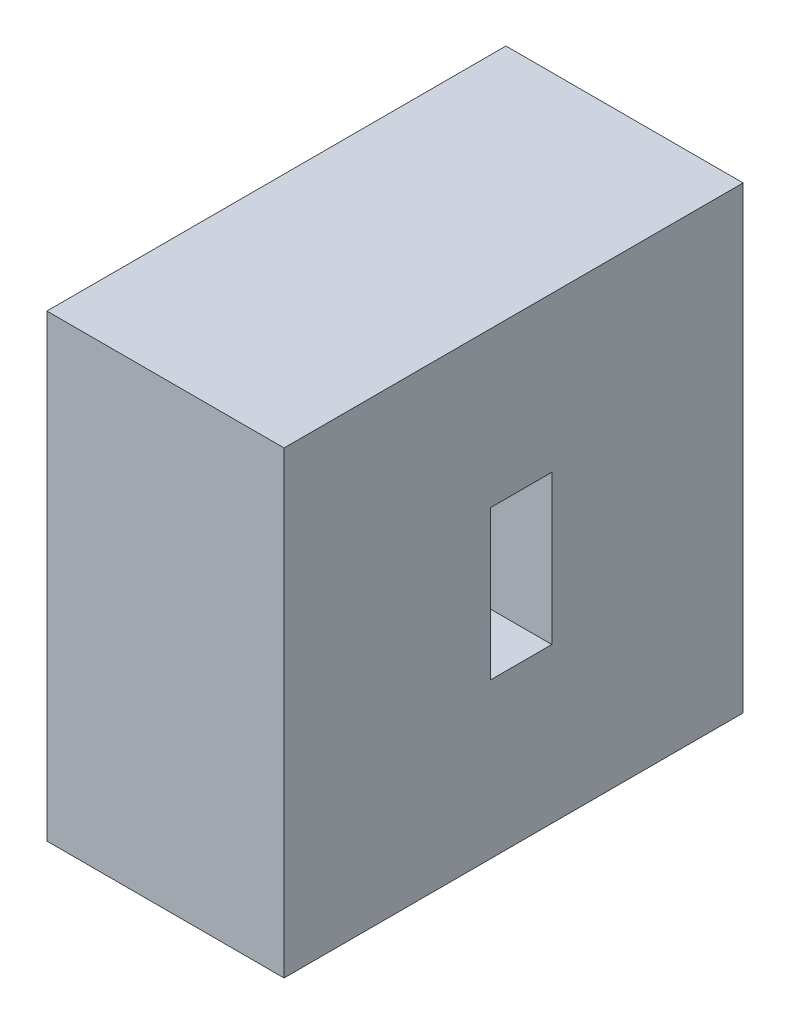
ISO-10303-21;
HEADER;
FILE_DESCRIPTION(('STEP AP214'),'2;1');
FILE_NAME('part.step','',(''),(''),'','','');
FILE_SCHEMA(('AUTOMOTIVE_DESIGN { 1 0 10303 214 1 1 1 1 }'));
ENDSEC;
DATA;
#1=APPLICATION_CONTEXT('core data for automotive mechanical design processes');
#2=APPLICATION_PROTOCOL_DEFINITION('international standard','automotive_design',2000,#1);
#3=PRODUCT_CONTEXT('',#1,'mechanical');
#4=PRODUCT('Part','Part','',(#3));
#5=PRODUCT_RELATED_PRODUCT_CATEGORY('part','',(#4));
#6=PRODUCT_DEFINITION_FORMATION('','',#4);
#7=PRODUCT_DEFINITION_CONTEXT('part definition',#1,'design');
#8=PRODUCT_DEFINITION('design','',#6,#7);
#9=PRODUCT_DEFINITION_SHAPE('','',#8);
#10=(LENGTH_UNIT() NAMED_UNIT(*) SI_UNIT(.MILLI.,.METRE.));
#11=(NAMED_UNIT(*) PLANE_ANGLE_UNIT() SI_UNIT($,.RADIAN.));
#12=(NAMED_UNIT(*) SI_UNIT($,.STERADIAN.) SOLID_ANGLE_UNIT());
#13=UNCERTAINTY_MEASURE_WITH_UNIT(LENGTH_MEASURE(1.E-05),#10,'distance_accuracy_value','');
#14=(GEOMETRIC_REPRESENTATION_CONTEXT(3) GLOBAL_UNCERTAINTY_ASSIGNED_CONTEXT((#13)) GLOBAL_UNIT_ASSIGNED_CONTEXT((#10,
#11,#12)) REPRESENTATION_CONTEXT('',''));
#15=CARTESIAN_POINT('',(0.,0.,0.));
#16=DIRECTION('',(0.,0.,1.));
#17=DIRECTION('',(1.,0.,0.));
#18=AXIS2_PLACEMENT_3D('',#15,#16,#17);
#19=CARTESIAN_POINT('',(55.6,-6.,156.));
#20=DIRECTION('',(-1.,0.,0.));
#21=DIRECTION('',(0.,0.,1.));
#22=AXIS2_PLACEMENT_3D('',#19,#20,#21);
#23=PLANE('',#22);
#24=DIRECTION('',(0.,1.,0.));
#25=VECTOR('',#24,1.);
#26=CARTESIAN_POINT('',(55.6,-6.,144.));
#27=LINE('',#26,#25);
#28=CARTESIAN_POINT('',(55.6,-6.,144.));
#29=VERTEX_POINT('',#28);
#30=CARTESIAN_POINT('',(55.6,6.,144.));
#31=VERTEX_POINT('',#30);
#32=EDGE_CURVE('E200',#29,#31,#27,.T.);
#33=ORIENTED_EDGE('',*,*,#32,.T.);
#34=DIRECTION('',(0.,0.,-1.));
#35=VECTOR('',#34,1.);
#36=CARTESIAN_POINT('',(55.6,6.,156.));
#37=LINE('',#36,#35);
#38=CARTESIAN_POINT('',(55.6,6.,156.));
#39=VERTEX_POINT('',#38);
#40=EDGE_CURVE('E207',#39,#31,#37,.T.);
#41=ORIENTED_EDGE('',*,*,#40,.F.);
#42=DIRECTION('',(0.,1.,0.));
#43=VECTOR('',#42,1.);
#44=CARTESIAN_POINT('',(55.6,-6.,156.));
#45=LINE('',#44,#43);
#46=CARTESIAN_POINT('',(55.6,-6.,156.));
#47=VERTEX_POINT('',#46);
#48=EDGE_CURVE('E188',#47,#39,#45,.T.);
#49=ORIENTED_EDGE('',*,*,#48,.F.);
#50=DIRECTION('',(0.,0.,-1.));
#51=VECTOR('',#50,1.);
#52=CARTESIAN_POINT('',(55.6,-6.,156.));
#53=LINE('',#52,#51);
#54=EDGE_CURVE('E210',#47,#29,#53,.T.);
#55=ORIENTED_EDGE('',*,*,#54,.T.);
#56=EDGE_LOOP('',(#33,#41,#49,#55));
#57=FACE_BOUND('',#56,.T.);
#58=DIRECTION('',(0.,-1.,0.));
#59=VECTOR('',#58,1.);
#60=CARTESIAN_POINT('',(55.6,-6.,150.6));
#61=LINE('',#60,#59);
#62=CARTESIAN_POINT('',(55.6,1.95,150.6));
#63=VERTEX_POINT('',#62);
#64=CARTESIAN_POINT('',(55.6,-1.95,150.6));
#65=VERTEX_POINT('',#64);
#66=EDGE_CURVE('E11',#63,#65,#61,.T.);
#67=ORIENTED_EDGE('',*,*,#66,.F.);
#68=DIRECTION('',(0.,0.,1.));
#69=VECTOR('',#68,1.);
#70=CARTESIAN_POINT('',(55.6,1.95,156.));
#71=LINE('',#70,#69);
#72=CARTESIAN_POINT('',(55.6,1.95,149.));
#73=VERTEX_POINT('',#72);
#74=EDGE_CURVE('E221',#73,#63,#71,.T.);
#75=ORIENTED_EDGE('',*,*,#74,.F.);
#76=DIRECTION('',(0.,-1.,0.));
#77=VECTOR('',#76,1.);
#78=CARTESIAN_POINT('',(55.6,-6.,149.));
#79=LINE('',#78,#77);
#80=CARTESIAN_POINT('',(55.6,-1.95,149.));
#81=VERTEX_POINT('',#80);
#82=EDGE_CURVE('E217',#73,#81,#79,.T.);
#83=ORIENTED_EDGE('',*,*,#82,.T.);
#84=DIRECTION('',(0.,0.,-1.));
#85=VECTOR('',#84,1.);
#86=CARTESIAN_POINT('',(55.6,-1.95,156.));
#87=LINE('',#86,#85);
#88=EDGE_CURVE('E56',#65,#81,#87,.T.);
#89=ORIENTED_EDGE('',*,*,#88,.F.);
#90=EDGE_LOOP('',(#67,#75,#83,#89));
#91=FACE_BOUND('',#90,.T.);
#92=ADVANCED_FACE('F47',(#57,#91),#23,.F.);
#93=CARTESIAN_POINT('',(49.4,-6.,156.));
#94=DIRECTION('',(1.,0.,0.));
#95=DIRECTION('',(0.,0.,-1.));
#96=AXIS2_PLACEMENT_3D('',#93,#94,#95);
#97=PLANE('',#96);
#98=DIRECTION('',(0.,-1.,0.));
#99=VECTOR('',#98,1.);
#100=CARTESIAN_POINT('',(49.4,-6.,144.));
#101=LINE('',#100,#99);
#102=CARTESIAN_POINT('',(49.4,6.,144.));
#103=VERTEX_POINT('',#102);
#104=CARTESIAN_POINT('',(49.4,-6.,144.));
#105=VERTEX_POINT('',#104);
#106=EDGE_CURVE('E179',#103,#105,#101,.T.);
#107=ORIENTED_EDGE('',*,*,#106,.T.);
#108=DIRECTION('',(0.,0.,-1.));
#109=VECTOR('',#108,1.);
#110=CARTESIAN_POINT('',(49.4,-6.,156.));
#111=LINE('',#110,#109);
#112=CARTESIAN_POINT('',(49.4,-6.,156.));
#113=VERTEX_POINT('',#112);
#114=EDGE_CURVE('E214',#113,#105,#111,.T.);
#115=ORIENTED_EDGE('',*,*,#114,.F.);
#116=DIRECTION('',(0.,-1.,0.));
#117=VECTOR('',#116,1.);
#118=CARTESIAN_POINT('',(49.4,-6.,156.));
#119=LINE('',#118,#117);
#120=CARTESIAN_POINT('',(49.4,6.,156.));
#121=VERTEX_POINT('',#120);
#122=EDGE_CURVE('E183',#121,#113,#119,.T.);
#123=ORIENTED_EDGE('',*,*,#122,.F.);
#124=DIRECTION('',(0.,0.,-1.));
#125=VECTOR('',#124,1.);
#126=CARTESIAN_POINT('',(49.4,6.,156.));
#127=LINE('',#126,#125);
#128=EDGE_CURVE('E193',#121,#103,#127,.T.);
#129=ORIENTED_EDGE('',*,*,#128,.T.);
#130=EDGE_LOOP('',(#107,#115,#123,#129));
#131=FACE_BOUND('',#130,.T.);
#132=ADVANCED_FACE('F49',(#131),#97,.F.);
#133=CARTESIAN_POINT('',(49.4,-6.,156.));
#134=DIRECTION('',(0.,1.,0.));
#135=DIRECTION('',(0.,0.,1.));
#136=AXIS2_PLACEMENT_3D('',#133,#134,#135);
#137=PLANE('',#136);
#138=DIRECTION('',(1.,0.,0.));
#139=VECTOR('',#138,1.);
#140=CARTESIAN_POINT('',(49.4,-6.,144.));
#141=LINE('',#140,#139);
#142=EDGE_CURVE('E197',#105,#29,#141,.T.);
#143=ORIENTED_EDGE('',*,*,#142,.T.);
#144=ORIENTED_EDGE('',*,*,#54,.F.);
#145=DIRECTION('',(1.,0.,0.));
#146=VECTOR('',#145,1.);
#147=CARTESIAN_POINT('',(49.4,-6.,156.));
#148=LINE('',#147,#146);
#149=EDGE_CURVE('E101',#113,#47,#148,.T.);
#150=ORIENTED_EDGE('',*,*,#149,.F.);
#151=ORIENTED_EDGE('',*,*,#114,.T.);
#152=EDGE_LOOP('',(#143,#144,#150,#151));
#153=FACE_BOUND('',#152,.T.);
#154=ADVANCED_FACE('F264',(#153),#137,.F.);
#155=CARTESIAN_POINT('',(49.4,6.,156.));
#156=DIRECTION('',(0.,-1.,0.));
#157=DIRECTION('',(0.,0.,-1.));
#158=AXIS2_PLACEMENT_3D('',#155,#156,#157);
#159=PLANE('',#158);
#160=DIRECTION('',(-1.,0.,0.));
#161=VECTOR('',#160,1.);
#162=CARTESIAN_POINT('',(49.4,6.,144.));
#163=LINE('',#162,#161);
#164=EDGE_CURVE('E93',#31,#103,#163,.T.);
#165=ORIENTED_EDGE('',*,*,#164,.T.);
#166=ORIENTED_EDGE('',*,*,#128,.F.);
#167=DIRECTION('',(-1.,0.,0.));
#168=VECTOR('',#167,1.);
#169=CARTESIAN_POINT('',(49.4,6.,156.));
#170=LINE('',#169,#168);
#171=EDGE_CURVE('E72',#39,#121,#170,.T.);
#172=ORIENTED_EDGE('',*,*,#171,.F.);
#173=ORIENTED_EDGE('',*,*,#40,.T.);
#174=EDGE_LOOP('',(#165,#166,#172,#173));
#175=FACE_BOUND('',#174,.T.);
#176=ADVANCED_FACE('F267',(#175),#159,.F.);
#177=CARTESIAN_POINT('',(0.,0.,156.));
#178=DIRECTION('',(0.,0.,-1.));
#179=DIRECTION('',(-1.,0.,0.));
#180=AXIS2_PLACEMENT_3D('',#177,#178,#179);
#181=PLANE('',#180);
#182=ORIENTED_EDGE('',*,*,#122,.T.);
#183=ORIENTED_EDGE('',*,*,#149,.T.);
#184=ORIENTED_EDGE('',*,*,#48,.T.);
#185=ORIENTED_EDGE('',*,*,#171,.T.);
#186=EDGE_LOOP('',(#182,#183,#184,#185));
#187=FACE_BOUND('',#186,.T.);
#188=ADVANCED_FACE('F273',(#187),#181,.F.);
#189=CARTESIAN_POINT('',(0.,0.,144.));
#190=DIRECTION('',(0.,0.,-1.));
#191=DIRECTION('',(-1.,0.,0.));
#192=AXIS2_PLACEMENT_3D('',#189,#190,#191);
#193=PLANE('',#192);
#194=ORIENTED_EDGE('',*,*,#106,.F.);
#195=ORIENTED_EDGE('',*,*,#164,.F.);
#196=ORIENTED_EDGE('',*,*,#32,.F.);
#197=ORIENTED_EDGE('',*,*,#142,.F.);
#198=EDGE_LOOP('',(#194,#195,#196,#197));
#199=FACE_BOUND('',#198,.T.);
#200=ADVANCED_FACE('F280',(#199),#193,.T.);
#201=CARTESIAN_POINT('',(52.9,-1.95,150.6));
#202=DIRECTION('',(0.,1.,0.));
#203=DIRECTION('',(0.,0.,1.));
#204=AXIS2_PLACEMENT_3D('',#201,#202,#203);
#205=PLANE('',#204);
#206=ORIENTED_EDGE('',*,*,#88,.T.);
#207=DIRECTION('',(1.,0.,0.));
#208=VECTOR('',#207,1.);
#209=CARTESIAN_POINT('',(52.9,-1.95,149.));
#210=LINE('',#209,#208);
#211=CARTESIAN_POINT('',(51.2,-1.95,149.));
#212=VERTEX_POINT('',#211);
#213=EDGE_CURVE('E63',#212,#81,#210,.T.);
#214=ORIENTED_EDGE('',*,*,#213,.F.);
#215=DIRECTION('',(0.,0.,-1.));
#216=VECTOR('',#215,1.);
#217=CARTESIAN_POINT('',(51.2,-1.95,151.1));
#218=LINE('',#217,#216);
#219=CARTESIAN_POINT('',(51.2,-1.95,151.1));
#220=VERTEX_POINT('',#219);
#221=EDGE_CURVE('E151',#220,#212,#218,.T.);
#222=ORIENTED_EDGE('',*,*,#221,.F.);
#223=DIRECTION('',(1.,0.,0.));
#224=VECTOR('',#223,1.);
#225=CARTESIAN_POINT('',(51.2,-1.95,151.1));
#226=LINE('',#225,#224);
#227=CARTESIAN_POINT('',(52.9,-1.95,151.1));
#228=VERTEX_POINT('',#227);
#229=EDGE_CURVE('E134',#220,#228,#226,.T.);
#230=ORIENTED_EDGE('',*,*,#229,.T.);
#231=DIRECTION('',(0.,0.,-1.));
#232=VECTOR('',#231,1.);
#233=CARTESIAN_POINT('',(52.9,-1.95,151.1));
#234=LINE('',#233,#232);
#235=CARTESIAN_POINT('',(52.9,-1.95,150.6));
#236=VERTEX_POINT('',#235);
#237=EDGE_CURVE('E159',#228,#236,#234,.T.);
#238=ORIENTED_EDGE('',*,*,#237,.T.);
#239=DIRECTION('',(1.,0.,0.));
#240=VECTOR('',#239,1.);
#241=CARTESIAN_POINT('',(52.9,-1.95,150.6));
#242=LINE('',#241,#240);
#243=EDGE_CURVE('E172',#236,#65,#242,.T.);
#244=ORIENTED_EDGE('',*,*,#243,.T.);
#245=EDGE_LOOP('',(#206,#214,#222,#230,#238,#244));
#246=FACE_BOUND('',#245,.T.);
#247=ADVANCED_FACE('F157',(#246),#205,.T.);
#248=CARTESIAN_POINT('',(52.9,1.95,150.6));
#249=DIRECTION('',(0.,-1.,0.));
#250=DIRECTION('',(0.,0.,-1.));
#251=AXIS2_PLACEMENT_3D('',#248,#249,#250);
#252=PLANE('',#251);
#253=ORIENTED_EDGE('',*,*,#74,.T.);
#254=DIRECTION('',(-1.,0.,0.));
#255=VECTOR('',#254,1.);
#256=CARTESIAN_POINT('',(52.9,1.95,150.6));
#257=LINE('',#256,#255);
#258=CARTESIAN_POINT('',(52.9,1.95,150.6));
#259=VERTEX_POINT('',#258);
#260=EDGE_CURVE('E176',#63,#259,#257,.T.);
#261=ORIENTED_EDGE('',*,*,#260,.T.);
#262=DIRECTION('',(0.,0.,-1.));
#263=VECTOR('',#262,1.);
#264=CARTESIAN_POINT('',(52.9,1.95,151.1));
#265=LINE('',#264,#263);
#266=CARTESIAN_POINT('',(52.9,1.95,151.1));
#267=VERTEX_POINT('',#266);
#268=EDGE_CURVE('E165',#267,#259,#265,.T.);
#269=ORIENTED_EDGE('',*,*,#268,.F.);
#270=DIRECTION('',(-1.,0.,0.));
#271=VECTOR('',#270,1.);
#272=CARTESIAN_POINT('',(51.2,1.95,151.1));
#273=LINE('',#272,#271);
#274=CARTESIAN_POINT('',(51.2,1.95,151.1));
#275=VERTEX_POINT('',#274);
#276=EDGE_CURVE('E235',#267,#275,#273,.T.);
#277=ORIENTED_EDGE('',*,*,#276,.T.);
#278=DIRECTION('',(0.,0.,-1.));
#279=VECTOR('',#278,1.);
#280=CARTESIAN_POINT('',(51.2,1.95,151.1));
#281=LINE('',#280,#279);
#282=CARTESIAN_POINT('',(51.2,1.95,149.));
#283=VERTEX_POINT('',#282);
#284=EDGE_CURVE('E153',#275,#283,#281,.T.);
#285=ORIENTED_EDGE('',*,*,#284,.T.);
#286=DIRECTION('',(-1.,0.,0.));
#287=VECTOR('',#286,1.);
#288=CARTESIAN_POINT('',(52.9,1.95,149.));
#289=LINE('',#288,#287);
#290=EDGE_CURVE('E163',#73,#283,#289,.T.);
#291=ORIENTED_EDGE('',*,*,#290,.F.);
#292=EDGE_LOOP('',(#253,#261,#269,#277,#285,#291));
#293=FACE_BOUND('',#292,.T.);
#294=ADVANCED_FACE('F232',(#293),#252,.T.);
#295=CARTESIAN_POINT('',(0.,0.,150.6));
#296=DIRECTION('',(0.,0.,-1.));
#297=DIRECTION('',(-1.,0.,0.));
#298=AXIS2_PLACEMENT_3D('',#295,#296,#297);
#299=PLANE('',#298);
#300=ORIENTED_EDGE('',*,*,#66,.T.);
#301=ORIENTED_EDGE('',*,*,#243,.F.);
#302=DIRECTION('',(0.,-1.,0.));
#303=VECTOR('',#302,1.);
#304=CARTESIAN_POINT('',(52.9,-1.95,150.6));
#305=LINE('',#304,#303);
#306=EDGE_CURVE('E169',#259,#236,#305,.T.);
#307=ORIENTED_EDGE('',*,*,#306,.F.);
#308=ORIENTED_EDGE('',*,*,#260,.F.);
#309=EDGE_LOOP('',(#300,#301,#307,#308));
#310=FACE_BOUND('',#309,.T.);
#311=ADVANCED_FACE('F247',(#310),#299,.T.);
#312=CARTESIAN_POINT('',(0.,0.,149.));
#313=DIRECTION('',(0.,0.,-1.));
#314=DIRECTION('',(-1.,0.,0.));
#315=AXIS2_PLACEMENT_3D('',#312,#313,#314);
#316=PLANE('',#315);
#317=ORIENTED_EDGE('',*,*,#290,.T.);
#318=DIRECTION('',(0.,-1.,0.));
#319=VECTOR('',#318,1.);
#320=CARTESIAN_POINT('',(51.2,-1.95,149.));
#321=LINE('',#320,#319);
#322=EDGE_CURVE('E155',#283,#212,#321,.T.);
#323=ORIENTED_EDGE('',*,*,#322,.T.);
#324=ORIENTED_EDGE('',*,*,#213,.T.);
#325=ORIENTED_EDGE('',*,*,#82,.F.);
#326=EDGE_LOOP('',(#317,#323,#324,#325));
#327=FACE_BOUND('',#326,.T.);
#328=ADVANCED_FACE('F230',(#327),#316,.F.);
#329=CARTESIAN_POINT('',(52.9,-1.95,151.1));
#330=DIRECTION('',(-1.,0.,0.));
#331=DIRECTION('',(0.,0.,1.));
#332=AXIS2_PLACEMENT_3D('',#329,#330,#331);
#333=PLANE('',#332);
#334=ORIENTED_EDGE('',*,*,#306,.T.);
#335=ORIENTED_EDGE('',*,*,#237,.F.);
#336=DIRECTION('',(0.,1.,0.));
#337=VECTOR('',#336,1.);
#338=CARTESIAN_POINT('',(52.9,-1.95,151.1));
#339=LINE('',#338,#337);
#340=EDGE_CURVE('E139',#228,#267,#339,.T.);
#341=ORIENTED_EDGE('',*,*,#340,.T.);
#342=ORIENTED_EDGE('',*,*,#268,.T.);
#343=EDGE_LOOP('',(#334,#335,#341,#342));
#344=FACE_BOUND('',#343,.T.);
#345=ADVANCED_FACE('F244',(#344),#333,.T.);
#346=CARTESIAN_POINT('',(51.2,-1.95,151.1));
#347=DIRECTION('',(1.,0.,0.));
#348=DIRECTION('',(0.,0.,-1.));
#349=AXIS2_PLACEMENT_3D('',#346,#347,#348);
#350=PLANE('',#349);
#351=ORIENTED_EDGE('',*,*,#322,.F.);
#352=ORIENTED_EDGE('',*,*,#284,.F.);
#353=DIRECTION('',(0.,-1.,0.));
#354=VECTOR('',#353,1.);
#355=CARTESIAN_POINT('',(51.2,-1.95,151.1));
#356=LINE('',#355,#354);
#357=EDGE_CURVE('E138',#275,#220,#356,.T.);
#358=ORIENTED_EDGE('',*,*,#357,.T.);
#359=ORIENTED_EDGE('',*,*,#221,.T.);
#360=EDGE_LOOP('',(#351,#352,#358,#359));
#361=FACE_BOUND('',#360,.T.);
#362=ADVANCED_FACE('F150',(#361),#350,.T.);
#363=CARTESIAN_POINT('',(0.,0.,151.1));
#364=DIRECTION('',(0.,0.,-1.));
#365=DIRECTION('',(-1.,0.,0.));
#366=AXIS2_PLACEMENT_3D('',#363,#364,#365);
#367=PLANE('',#366);
#368=ORIENTED_EDGE('',*,*,#357,.F.);
#369=ORIENTED_EDGE('',*,*,#276,.F.);
#370=ORIENTED_EDGE('',*,*,#340,.F.);
#371=ORIENTED_EDGE('',*,*,#229,.F.);
#372=EDGE_LOOP('',(#368,#369,#370,#371));
#373=FACE_BOUND('',#372,.T.);
#374=ADVANCED_FACE('F136',(#373),#367,.T.);
#375=CLOSED_SHELL('',(#92,#132,#154,#176,#188,#200,#247,#294,#311,#328,#345,#362,#374));
#376=MANIFOLD_SOLID_BREP('B2',#375);
#377=ADVANCED_BREP_SHAPE_REPRESENTATION('',(#18,#376),#14);
#378=SHAPE_DEFINITION_REPRESENTATION(#9,#377);
ENDSEC;
END-ISO-10303-21;
